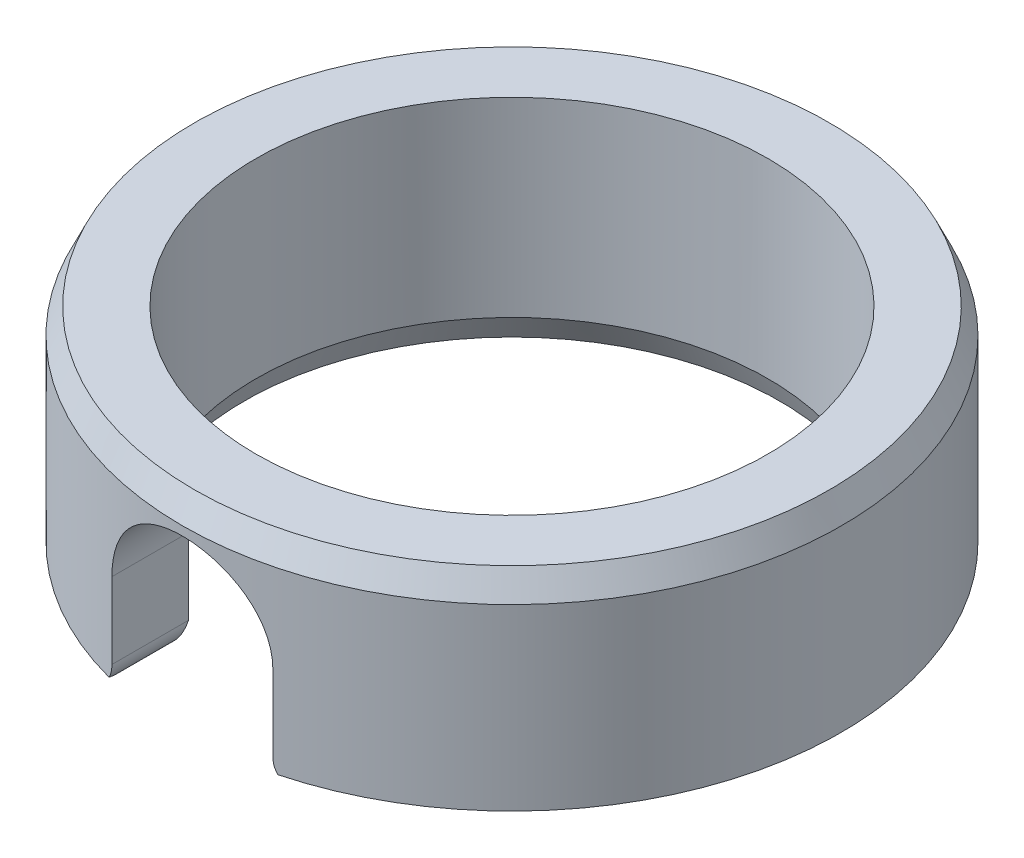
ISO-10303-21;
HEADER;
FILE_DESCRIPTION(('STEP AP214'),'2;1');
FILE_NAME('part.step','',(''),(''),'','','');
FILE_SCHEMA(('AUTOMOTIVE_DESIGN { 1 0 10303 214 1 1 1 1 }'));
ENDSEC;
DATA;
#1=APPLICATION_CONTEXT('core data for automotive mechanical design processes');
#2=APPLICATION_PROTOCOL_DEFINITION('international standard','automotive_design',2000,#1);
#3=PRODUCT_CONTEXT('',#1,'mechanical');
#4=PRODUCT('Part','Part','',(#3));
#5=PRODUCT_RELATED_PRODUCT_CATEGORY('part','',(#4));
#6=PRODUCT_DEFINITION_FORMATION('','',#4);
#7=PRODUCT_DEFINITION_CONTEXT('part definition',#1,'design');
#8=PRODUCT_DEFINITION('design','',#6,#7);
#9=PRODUCT_DEFINITION_SHAPE('','',#8);
#10=(LENGTH_UNIT() NAMED_UNIT(*) SI_UNIT(.MILLI.,.METRE.));
#11=(NAMED_UNIT(*) PLANE_ANGLE_UNIT() SI_UNIT($,.RADIAN.));
#12=(NAMED_UNIT(*) SI_UNIT($,.STERADIAN.) SOLID_ANGLE_UNIT());
#13=UNCERTAINTY_MEASURE_WITH_UNIT(LENGTH_MEASURE(1.E-05),#10,'distance_accuracy_value','');
#14=(GEOMETRIC_REPRESENTATION_CONTEXT(3) GLOBAL_UNCERTAINTY_ASSIGNED_CONTEXT((#13)) GLOBAL_UNIT_ASSIGNED_CONTEXT((#10,
#11,#12)) REPRESENTATION_CONTEXT('',''));
#15=CARTESIAN_POINT('',(0.,0.,0.));
#16=DIRECTION('',(0.,0.,1.));
#17=DIRECTION('',(1.,0.,0.));
#18=AXIS2_PLACEMENT_3D('',#15,#16,#17);
#19=CARTESIAN_POINT('',(0.,0.,0.));
#20=DIRECTION('',(0.,1.,0.));
#21=DIRECTION('',(0.,0.,1.));
#22=AXIS2_PLACEMENT_3D('',#19,#20,#21);
#23=PLANE('',#22);
#24=CARTESIAN_POINT('',(0.,0.,0.));
#25=DIRECTION('',(0.,1.,0.));
#26=DIRECTION('',(0.,0.,1.));
#27=AXIS2_PLACEMENT_3D('',#24,#25,#26);
#28=CIRCLE('',#27,12.);
#29=CARTESIAN_POINT('',(-4.175,0.,11.2503055514061));
#30=VERTEX_POINT('',#29);
#31=CARTESIAN_POINT('',(4.175,0.,11.2503055514061));
#32=VERTEX_POINT('',#31);
#33=EDGE_CURVE('E165',#30,#32,#28,.F.);
#34=ORIENTED_EDGE('',*,*,#33,.T.);
#35=DIRECTION('',(0.,0.,-1.));
#36=VECTOR('',#35,1.);
#37=CARTESIAN_POINT('',(4.175,0.,10.0780073688594));
#38=LINE('',#37,#36);
#39=CARTESIAN_POINT('',(4.175,0.,9.70650465032521));
#40=VERTEX_POINT('',#39);
#41=EDGE_CURVE('E168',#32,#40,#38,.T.);
#42=ORIENTED_EDGE('',*,*,#41,.T.);
#43=CARTESIAN_POINT('',(0.,0.,0.));
#44=DIRECTION('',(0.,1.,0.));
#45=DIRECTION('',(0.,0.,1.));
#46=AXIS2_PLACEMENT_3D('',#43,#44,#45);
#47=CIRCLE('',#46,10.566307658155);
#48=CARTESIAN_POINT('',(-4.175,0.,9.70650465032521));
#49=VERTEX_POINT('',#48);
#50=EDGE_CURVE('E172',#40,#49,#47,.T.);
#51=ORIENTED_EDGE('',*,*,#50,.T.);
#52=DIRECTION('',(0.,0.,-1.));
#53=VECTOR('',#52,1.);
#54=CARTESIAN_POINT('',(-4.175,0.,11.5723539092096));
#55=LINE('',#54,#53);
#56=EDGE_CURVE('E171',#49,#30,#55,.F.);
#57=ORIENTED_EDGE('',*,*,#56,.T.);
#58=EDGE_LOOP('',(#34,#42,#51,#57));
#59=FACE_BOUND('',#58,.T.);
#60=ADVANCED_FACE('F36',(#59),#23,.F.);
#61=CARTESIAN_POINT('',(0.,8.5222,0.));
#62=DIRECTION('',(0.,-1.,0.));
#63=DIRECTION('',(0.,0.,-1.));
#64=AXIS2_PLACEMENT_3D('',#61,#62,#63);
#65=CYLINDRICAL_SURFACE('',#64,13.);
#66=CARTESIAN_POINT('',(0.,7.52219999999998,0.));
#67=DIRECTION('',(0.,1.,0.));
#68=DIRECTION('',(0.,0.,1.));
#69=AXIS2_PLACEMENT_3D('',#66,#67,#68);
#70=CIRCLE('',#69,13.);
#71=CARTESIAN_POINT('',(0.,7.52219999999998,13.));
#72=VERTEX_POINT('',#71);
#73=EDGE_CURVE('E242',#72,#72,#70,.F.);
#74=ORIENTED_EDGE('',*,*,#73,.T.);
#75=EDGE_LOOP('',(#74));
#76=FACE_BOUND('',#75,.T.);
#77=DIRECTION('',(0.,-1.,0.));
#78=VECTOR('',#77,1.);
#79=CARTESIAN_POINT('',(3.175,8.5222,12.6063228183321));
#80=LINE('',#79,#78);
#81=CARTESIAN_POINT('',(3.175,1.,12.6063228183321));
#82=VERTEX_POINT('',#81);
#83=CARTESIAN_POINT('',(3.175,4.,12.6063228183321));
#84=VERTEX_POINT('',#83);
#85=EDGE_CURVE('E109',#82,#84,#80,.F.);
#86=ORIENTED_EDGE('',*,*,#85,.F.);
#87=CARTESIAN_POINT('',(3.175,1.,12.6063228183321));
#88=CARTESIAN_POINT('',(3.17500023984745,0.972207944779752,12.6063221924203));
#89=CARTESIAN_POINT('',(3.17615952654659,0.944431586658988,12.6060308357941));
#90=CARTESIAN_POINT('',(3.18078206207391,0.889080668877479,12.604865491831));
#91=CARTESIAN_POINT('',(3.18424555028913,0.861506130485058,12.6039914439573));
#92=CARTESIAN_POINT('',(3.19784301795716,0.78070290364726,12.6005512176184));
#93=CARTESIAN_POINT('',(3.21118821717571,0.728004388055886,12.5971663252682));
#94=CARTESIAN_POINT('',(3.24117892568194,0.64015772501383,12.5894766939692));
#95=CARTESIAN_POINT('',(3.25582690792811,0.604257448940297,12.5857019888294));
#96=CARTESIAN_POINT('',(3.28939991579291,0.533887391529717,12.5769688879727));
#97=CARTESIAN_POINT('',(3.30839504268942,0.499453452204882,12.5719910065933));
#98=CARTESIAN_POINT('',(3.32932128780724,0.466307658155002,12.5664481760979));
#99=B_SPLINE_CURVE_WITH_KNOTS('',3,(#87,#88,#89,#90,#91,#92,#93,#94,#95,#96,#97,#98),
.UNSPECIFIED.,.F.,.F.,(4,2,2,2,2,4),(0.,0.0833193461441916,0.166647349815072,0.329185528440588,
0.445804285504046,0.564455786169551),.UNSPECIFIED.);
#100=CARTESIAN_POINT('',(3.32932128780724,0.466307658155002,12.5664481760979));
#101=VERTEX_POINT('',#100);
#102=EDGE_CURVE('E217',#82,#101,#99,.T.);
#103=ORIENTED_EDGE('',*,*,#102,.T.);
#104=CARTESIAN_POINT('',(0.,0.466307658155002,0.));
#105=DIRECTION('',(0.,1.,0.));
#106=DIRECTION('',(0.,0.,1.));
#107=AXIS2_PLACEMENT_3D('',#104,#105,#106);
#108=CIRCLE('',#107,13.);
#109=CARTESIAN_POINT('',(-3.32932128780724,0.466307658155002,12.5664481760979));
#110=VERTEX_POINT('',#109);
#111=EDGE_CURVE('E245',#101,#110,#108,.T.);
#112=ORIENTED_EDGE('',*,*,#111,.T.);
#113=CARTESIAN_POINT('',(-3.32932128780724,0.466307658155002,12.5664481760979));
#114=CARTESIAN_POINT('',(-3.3146339147258,0.489581659288447,12.5703391937686));
#115=CARTESIAN_POINT('',(-3.30089432935479,0.513483028317116,12.5739520155139));
#116=CARTESIAN_POINT('',(-3.27540392853389,0.562405435888356,12.5806161824473));
#117=CARTESIAN_POINT('',(-3.26365356886449,0.587426729377128,12.5836673989718));
#118=CARTESIAN_POINT('',(-3.23206671790876,0.662686016902155,12.5918312691069));
#119=CARTESIAN_POINT('',(-3.2151587310711,0.714289331923373,12.5961470879905));
#120=CARTESIAN_POINT('',(-3.19348463363715,0.804705918081518,12.6016564351079));
#121=CARTESIAN_POINT('',(-3.18663700431524,0.843009026171563,12.6033877929176));
#122=CARTESIAN_POINT('',(-3.17735131405145,0.920859328719894,12.6057306401717));
#123=CARTESIAN_POINT('',(-3.17499236067866,0.960416567577988,12.6063220415455));
#124=CARTESIAN_POINT('',(-3.175,1.,12.6063228183321));
#125=B_SPLINE_CURVE_WITH_KNOTS('',3,(#113,#114,#115,#116,#117,#118,#119,#120,#121,#122,#123,
#124),.UNSPECIFIED.,.F.,.F.,(4,2,2,2,2,4),(0.,0.083329666978949,0.166678401066295,
0.329241375331635,0.44582986509137,0.564454717051472),.UNSPECIFIED.);
#126=CARTESIAN_POINT('',(-3.175,1.,12.6063228183321));
#127=VERTEX_POINT('',#126);
#128=EDGE_CURVE('E52',#110,#127,#125,.T.);
#129=ORIENTED_EDGE('',*,*,#128,.T.);
#130=DIRECTION('',(0.,-1.,0.));
#131=VECTOR('',#130,1.);
#132=CARTESIAN_POINT('',(-3.175,8.5222,12.6063228183321));
#133=LINE('',#132,#131);
#134=CARTESIAN_POINT('',(-3.175,4.,12.6063228183321));
#135=VERTEX_POINT('',#134);
#136=EDGE_CURVE('E110',#135,#127,#133,.T.);
#137=ORIENTED_EDGE('',*,*,#136,.F.);
#138=CARTESIAN_POINT('',(3.175,4.,12.6063228183321));
#139=CARTESIAN_POINT('',(3.17501009851098,4.08787378597044,12.6063132651038));
#140=CARTESIAN_POINT('',(3.17135205246371,4.17574163314016,12.6072414061624));
#141=CARTESIAN_POINT('',(3.15677809224827,4.35082163667164,12.6109022385434));
#142=CARTESIAN_POINT('',(3.14586335778261,4.43803389728038,12.6136346365515));
#143=CARTESIAN_POINT('',(3.11688221350419,4.61102183710995,12.6208262840811));
#144=CARTESIAN_POINT('',(3.09882956040884,4.69679995081072,12.6252822115338));
#145=CARTESIAN_POINT('',(3.05573924696344,4.86646035879583,12.6357803710173));
#146=CARTESIAN_POINT('',(3.0307014992745,4.95034262936113,12.6418226228829));
#147=CARTESIAN_POINT('',(2.94538203174719,5.19825788694416,12.6620768224457));
#148=CARTESIAN_POINT('',(2.87486550593256,5.35872839791942,12.6784237603703));
#149=CARTESIAN_POINT('',(2.70871790710507,5.66552296377543,12.7149532550345));
#150=CARTESIAN_POINT('',(2.61308061908652,5.81184350560743,12.7351367606187));
#151=CARTESIAN_POINT('',(2.39725547071148,6.08931557258449,12.7775372544766));
#152=CARTESIAN_POINT('',(2.2766401517653,6.22013049083328,12.7997853209167));
#153=CARTESIAN_POINT('',(2.01520014546072,6.45989161030491,12.8435394802179));
#154=CARTESIAN_POINT('',(1.87437224902378,6.56883433235655,12.8650454545859));
#155=CARTESIAN_POINT('',(1.57419315491871,6.76313546468767,12.9052358723955));
#156=CARTESIAN_POINT('',(1.41462099510097,6.84816180457834,12.9238790969982));
#157=CARTESIAN_POINT('',(1.08292663079487,6.99005332171802,12.9558862783522));
#158=CARTESIAN_POINT('',(0.910806824940755,7.04692386517736,12.9692512409886));
#159=CARTESIAN_POINT('',(0.562432144797513,7.12981307329099,12.9889763366451));
#160=CARTESIAN_POINT('',(0.386321836070524,7.15640771066527,12.9954670729382));
#161=CARTESIAN_POINT('',(0.0320237903202308,7.17979674776153,13.001167073455));
#162=CARTESIAN_POINT('',(-0.146163696822422,7.17659469576418,13.0003772046755));
#163=CARTESIAN_POINT('',(-0.495559824196341,7.14089726494223,12.9917024330288));
#164=CARTESIAN_POINT('',(-0.66683633645111,7.10902408502989,12.9839682372075));
#165=CARTESIAN_POINT('',(-1.00153097298404,7.01788790399895,12.9624486739077));
#166=CARTESIAN_POINT('',(-1.16494875857107,6.95862372356376,12.9486630458867));
#167=CARTESIAN_POINT('',(-1.48094705402903,6.81387467110486,12.9163565307896));
#168=CARTESIAN_POINT('',(-1.63342041224417,6.72816524782373,12.8977953267573));
#169=CARTESIAN_POINT('',(-1.92203607368809,6.53313014203601,12.8579560541876));
#170=CARTESIAN_POINT('',(-2.05817604688336,6.42380109629582,12.8366775989132));
#171=CARTESIAN_POINT('',(-2.3139591897748,6.18129971086971,12.7930794362632));
#172=CARTESIAN_POINT('',(-2.43308733710246,6.04758592906107,12.7707470254997));
#173=CARTESIAN_POINT('',(-2.64736905217607,5.76180547562919,12.7280561405833));
#174=CARTESIAN_POINT('',(-2.74251606792799,5.60973380511136,12.7076982068187));
#175=CARTESIAN_POINT('',(-2.90645104355116,5.29055437412133,12.6712137286851));
#176=CARTESIAN_POINT('',(-2.97510532370128,5.12337547964163,12.6551087699541));
#177=CARTESIAN_POINT('',(-3.08308837814951,4.77946170261939,12.6292399245633));
#178=CARTESIAN_POINT('',(-3.12246093942907,4.60274151404603,12.6194665726462));
#179=CARTESIAN_POINT('',(-3.15603300411806,4.3537543037499,12.6110871362746));
#180=CARTESIAN_POINT('',(-3.16314703165299,4.28314345543998,12.6093031675515));
#181=CARTESIAN_POINT('',(-3.17262509936245,4.14169952347456,12.6069215996323));
#182=CARTESIAN_POINT('',(-3.17499687265751,4.07086699058227,12.6063220690103));
#183=CARTESIAN_POINT('',(-3.175,4.,12.6063228183321));
#184=B_SPLINE_CURVE_WITH_KNOTS('',3,(#138,#139,#140,#141,#142,#143,#144,#145,#146,#147,#148,
#149,#150,#151,#152,#153,#154,#155,#156,#157,#158,#159,#160,#161,#162,#163,#164,#165,#166,#167,
#168,#169,#170,#171,#172,#173,#174,#175,#176,#177,#178,#179,#180,#181,#182,#183),.UNSPECIFIED.,
.F.,.F.,(4,2,2,2,2,2,2,2,2,2,2,2,2,2,2,2,2,2,2,2,2,2,4),(0.,0.263530091183203,0.527017351380499,
0.789999255766269,1.05298444852231,1.57844638130477,2.10403843871948,2.63950435018495,
3.17505536988955,3.71771158457418,4.26026433461408,4.79231333969312,5.32429898756418,
5.84501121703347,6.36574586780086,6.8910298674039,7.41638871234221,7.95527466181701,
8.49430768356239,9.03602611501808,9.57693283955251,9.78977044600888,10.0022606974916),.UNSPECIFIED.);
#185=EDGE_CURVE('E100',#84,#135,#184,.T.);
#186=ORIENTED_EDGE('',*,*,#185,.F.);
#187=EDGE_LOOP('',(#86,#103,#112,#129,#137,#186));
#188=FACE_BOUND('',#187,.T.);
#189=ADVANCED_FACE('F118',(#76,#188),#65,.T.);
#190=CARTESIAN_POINT('',(0.,8.5222,0.));
#191=DIRECTION('',(0.,-1.,0.));
#192=DIRECTION('',(0.,0.,-1.));
#193=AXIS2_PLACEMENT_3D('',#190,#191,#192);
#194=CYLINDRICAL_SURFACE('',#193,10.1);
#195=CARTESIAN_POINT('',(0.,8.5222,0.));
#196=DIRECTION('',(0.,1.,0.));
#197=DIRECTION('',(0.,0.,1.));
#198=AXIS2_PLACEMENT_3D('',#195,#196,#197);
#199=CIRCLE('',#198,10.1);
#200=CARTESIAN_POINT('',(0.,8.5222,10.1));
#201=VERTEX_POINT('',#200);
#202=EDGE_CURVE('E257',#201,#201,#199,.T.);
#203=ORIENTED_EDGE('',*,*,#202,.T.);
#204=EDGE_LOOP('',(#203));
#205=FACE_BOUND('',#204,.T.);
#206=DIRECTION('',(0.,-1.,0.));
#207=VECTOR('',#206,1.);
#208=CARTESIAN_POINT('',(-3.175,8.5222,9.58798075717719));
#209=LINE('',#208,#207);
#210=CARTESIAN_POINT('',(-3.175,4.,9.58798075717719));
#211=VERTEX_POINT('',#210);
#212=CARTESIAN_POINT('',(-3.175,1.00000000000001,9.58798075717719));
#213=VERTEX_POINT('',#212);
#214=EDGE_CURVE('E116',#211,#213,#209,.T.);
#215=ORIENTED_EDGE('',*,*,#214,.T.);
#216=CARTESIAN_POINT('',(0.,1.00000000000001,0.));
#217=DIRECTION('',(0.,1.,0.));
#218=DIRECTION('',(0.,0.,1.));
#219=AXIS2_PLACEMENT_3D('',#216,#217,#218);
#220=CIRCLE('',#219,10.1);
#221=CARTESIAN_POINT('',(3.175,1.00000000000001,9.58798075717719));
#222=VERTEX_POINT('',#221);
#223=EDGE_CURVE('E249',#213,#222,#220,.F.);
#224=ORIENTED_EDGE('',*,*,#223,.T.);
#225=DIRECTION('',(0.,-1.,0.));
#226=VECTOR('',#225,1.);
#227=CARTESIAN_POINT('',(3.175,8.5222,9.58798075717719));
#228=LINE('',#227,#226);
#229=CARTESIAN_POINT('',(3.175,4.,9.58798075717719));
#230=VERTEX_POINT('',#229);
#231=EDGE_CURVE('E147',#222,#230,#228,.F.);
#232=ORIENTED_EDGE('',*,*,#231,.T.);
#233=CARTESIAN_POINT('',(3.175,4.,9.58798075717719));
#234=CARTESIAN_POINT('',(3.17501110403846,4.08692347838906,9.58796790786724));
#235=CARTESIAN_POINT('',(3.17143060657522,4.17383967538083,9.58916251621892));
#236=CARTESIAN_POINT('',(3.15717284476817,4.34700422154223,9.5938710908655));
#237=CARTESIAN_POINT('',(3.14649730839338,4.43325272815239,9.59738449242591));
#238=CARTESIAN_POINT('',(3.11817420570668,4.60423985769642,9.6066226645862));
#239=CARTESIAN_POINT('',(3.10054558646608,4.68898193521027,9.61234142467388));
#240=CARTESIAN_POINT('',(3.05849249682685,4.8565761805437,9.62580427323813));
#241=CARTESIAN_POINT('',(3.03406782069659,4.93942829106765,9.63354842302729));
#242=CARTESIAN_POINT('',(2.95090981681227,5.18422100488252,9.65947949565651));
#243=CARTESIAN_POINT('',(2.88225359091744,5.3426302969105,9.68037855294418));
#244=CARTESIAN_POINT('',(2.72064109945418,5.64569216879029,9.72703165664799));
#245=CARTESIAN_POINT('',(2.62767200972875,5.79033743353579,9.75278826324065));
#246=CARTESIAN_POINT('',(2.4166165716316,6.06682215665654,9.80725167648352));
#247=CARTESIAN_POINT('',(2.29783454248537,6.19811841550925,9.83602563189224));
#248=CARTESIAN_POINT('',(2.04001349194838,6.43929190011796,9.89271164234553));
#249=CARTESIAN_POINT('',(1.900970982496,6.54916543008779,9.92062354797402));
#250=CARTESIAN_POINT('',(1.60263746566888,6.74679940664522,9.97321313387937));
#251=CARTESIAN_POINT('',(1.44295542775338,6.83399534559063,9.99780203011461));
#252=CARTESIAN_POINT('',(1.11029445485004,6.98007509157532,10.0401847718689));
#253=CARTESIAN_POINT('',(0.937319227682667,7.03896676041487,10.0579805039758));
#254=CARTESIAN_POINT('',(0.588704828610891,7.12494295664201,10.0842954772797));
#255=CARTESIAN_POINT('',(0.41331721675818,7.1529626730543,10.0930868607303));
#256=CARTESIAN_POINT('',(0.0601209450263003,7.17936362250599,10.101364266219));
#257=CARTESIAN_POINT('',(-0.117687199257961,7.17775107174336,10.1008522399082));
#258=CARTESIAN_POINT('',(-0.464085359933637,7.14554536770283,10.0907691973101));
#259=CARTESIAN_POINT('',(-0.63278040055622,7.11596665944189,10.0815152941289));
#260=CARTESIAN_POINT('',(-0.962675979439209,7.03033458117567,10.0553791770672));
#261=CARTESIAN_POINT('',(-1.12387611290808,6.97427978304667,10.0384965516945));
#262=CARTESIAN_POINT('',(-1.43653957134369,6.83663891109923,9.99857598515466));
#263=CARTESIAN_POINT('',(-1.58785826282529,6.75474643258653,9.97546468564356));
#264=CARTESIAN_POINT('',(-1.8749181551735,6.5680046876658,9.92551969960479));
#265=CARTESIAN_POINT('',(-2.01065552623607,6.46314979555823,9.89868510147521));
#266=CARTESIAN_POINT('',(-2.26873919353474,6.22826058277902,9.84281463940079));
#267=CARTESIAN_POINT('',(-2.39028220563004,6.09735275424085,9.81373366163234));
#268=CARTESIAN_POINT('',(-2.60994860345359,5.81674891470858,9.75761508849663));
#269=CARTESIAN_POINT('',(-2.70806489398501,5.66704723255653,9.73057811388186));
#270=CARTESIAN_POINT('',(-2.87908914208688,5.35060294375097,9.68136955450722));
#271=CARTESIAN_POINT('',(-2.95168204929347,5.18367817378625,9.65925993200412));
#272=CARTESIAN_POINT('',(-3.03846181932092,4.92555211717256,9.63216694333008));
#273=CARTESIAN_POINT('',(-3.06370112936791,4.83823536851029,9.62414867935728));
#274=CARTESIAN_POINT('',(-3.10663023235459,4.66160158960844,9.6103778519474));
#275=CARTESIAN_POINT('',(-3.12432349221659,4.57228549783227,9.60462424813925));
#276=CARTESIAN_POINT('',(-3.15040966796892,4.40256320321831,9.59609773866992));
#277=CARTESIAN_POINT('',(-3.15962996628368,4.3222957234519,9.59306073111703));
#278=CARTESIAN_POINT('',(-3.17192450252452,4.16135496600783,9.58899906712817));
#279=CARTESIAN_POINT('',(-3.17500736109734,4.08068241730107,9.58797158814452));
#280=CARTESIAN_POINT('',(-3.175,4.,9.58798075717719));
#281=B_SPLINE_CURVE_WITH_KNOTS('',3,(#233,#234,#235,#236,#237,#238,#239,#240,#241,#242,#243,
#244,#245,#246,#247,#248,#249,#250,#251,#252,#253,#254,#255,#256,#257,#258,#259,#260,#261,#262,
#263,#264,#265,#266,#267,#268,#269,#270,#271,#272,#273,#274,#275,#276,#277,#278,#279,#280),
.UNSPECIFIED.,.F.,.F.,(4,2,2,2,2,2,2,2,2,2,2,2,2,2,2,2,2,2,2,2,2,2,2,4),(0.,0.260676156874212,
0.521288850341595,0.781196229940401,1.04111147836541,1.56024307553596,2.07964905009505,
2.61532835383672,3.15109998978589,3.69915064935121,4.24704899414307,4.77785030629928,
5.30854026928509,5.82068985563875,6.33286707056274,6.85136210322621,7.36998430749708,
7.91041830266016,8.45101577077696,8.99806944537035,9.27150581261408,9.5448164178363,
9.787120626554,10.0290842540233),.UNSPECIFIED.);
#282=EDGE_CURVE('E140',#230,#211,#281,.T.);
#283=ORIENTED_EDGE('',*,*,#282,.T.);
#284=EDGE_LOOP('',(#215,#224,#232,#283));
#285=FACE_BOUND('',#284,.T.);
#286=ADVANCED_FACE('F149',(#205,#285),#194,.F.);
#287=CARTESIAN_POINT('',(0.,8.5222,0.));
#288=DIRECTION('',(0.,1.,0.));
#289=DIRECTION('',(0.,0.,1.));
#290=AXIS2_PLACEMENT_3D('',#287,#288,#289);
#291=PLANE('',#290);
#292=CARTESIAN_POINT('',(0.,8.5222,0.));
#293=DIRECTION('',(0.,1.,0.));
#294=DIRECTION('',(0.,0.,1.));
#295=AXIS2_PLACEMENT_3D('',#292,#293,#294);
#296=CIRCLE('',#295,12.533692341845);
#297=CARTESIAN_POINT('',(0.,8.5222,12.533692341845));
#298=VERTEX_POINT('',#297);
#299=EDGE_CURVE('E182',#298,#298,#296,.T.);
#300=ORIENTED_EDGE('',*,*,#299,.T.);
#301=EDGE_LOOP('',(#300));
#302=FACE_BOUND('',#301,.T.);
#303=ORIENTED_EDGE('',*,*,#202,.F.);
#304=EDGE_LOOP('',(#303));
#305=FACE_BOUND('',#304,.T.);
#306=ADVANCED_FACE('F153',(#302,#305),#291,.T.);
#307=CARTESIAN_POINT('',(3.175,0.,13.));
#308=DIRECTION('',(-1.,0.,0.));
#309=DIRECTION('',(0.,-1.,0.));
#310=AXIS2_PLACEMENT_3D('',#307,#308,#309);
#311=PLANE('',#310);
#312=ORIENTED_EDGE('',*,*,#231,.F.);
#313=DIRECTION('',(0.,0.,-1.));
#314=VECTOR('',#313,1.);
#315=CARTESIAN_POINT('',(3.175,1.,11.5723539092096));
#316=LINE('',#315,#314);
#317=EDGE_CURVE('E252',#222,#82,#316,.F.);
#318=ORIENTED_EDGE('',*,*,#317,.T.);
#319=ORIENTED_EDGE('',*,*,#85,.T.);
#320=DIRECTION('',(0.,0.,-1.));
#321=VECTOR('',#320,1.);
#322=CARTESIAN_POINT('',(3.175,4.,13.));
#323=LINE('',#322,#321);
#324=EDGE_CURVE('E107',#84,#230,#323,.T.);
#325=ORIENTED_EDGE('',*,*,#324,.T.);
#326=EDGE_LOOP('',(#312,#318,#319,#325));
#327=FACE_BOUND('',#326,.T.);
#328=ADVANCED_FACE('F136',(#327),#311,.T.);
#329=CARTESIAN_POINT('',(0.,4.,13.));
#330=DIRECTION('',(0.,0.,-1.));
#331=DIRECTION('',(-1.,0.,0.));
#332=AXIS2_PLACEMENT_3D('',#329,#330,#331);
#333=CYLINDRICAL_SURFACE('',#332,3.175);
#334=ORIENTED_EDGE('',*,*,#185,.T.);
#335=DIRECTION('',(0.,0.,-1.));
#336=VECTOR('',#335,1.);
#337=CARTESIAN_POINT('',(-3.175,4.,13.));
#338=LINE('',#337,#336);
#339=EDGE_CURVE('E104',#135,#211,#338,.T.);
#340=ORIENTED_EDGE('',*,*,#339,.T.);
#341=ORIENTED_EDGE('',*,*,#282,.F.);
#342=ORIENTED_EDGE('',*,*,#324,.F.);
#343=EDGE_LOOP('',(#334,#340,#341,#342));
#344=FACE_BOUND('',#343,.T.);
#345=ADVANCED_FACE('F102',(#344),#333,.F.);
#346=CARTESIAN_POINT('',(-3.175,4.,13.));
#347=DIRECTION('',(1.,0.,0.));
#348=DIRECTION('',(0.,1.,0.));
#349=AXIS2_PLACEMENT_3D('',#346,#347,#348);
#350=PLANE('',#349);
#351=ORIENTED_EDGE('',*,*,#136,.T.);
#352=DIRECTION('',(0.,0.,-1.));
#353=VECTOR('',#352,1.);
#354=CARTESIAN_POINT('',(-3.175,1.,10.0780073688594));
#355=LINE('',#354,#353);
#356=EDGE_CURVE('E11',#127,#213,#355,.T.);
#357=ORIENTED_EDGE('',*,*,#356,.T.);
#358=ORIENTED_EDGE('',*,*,#214,.F.);
#359=ORIENTED_EDGE('',*,*,#339,.F.);
#360=EDGE_LOOP('',(#351,#357,#358,#359));
#361=FACE_BOUND('',#360,.T.);
#362=ADVANCED_FACE('F113',(#361),#350,.T.);
#363=CARTESIAN_POINT('',(0.,0.,0.));
#364=DIRECTION('',(0.,-1.,0.));
#365=DIRECTION('',(0.,0.,-1.));
#366=AXIS2_PLACEMENT_3D('',#363,#364,#365);
#367=CONICAL_SURFACE('',#366,10.566307658155,0.436332312998579);
#368=ORIENTED_EDGE('',*,*,#50,.F.);
#369=CARTESIAN_POINT('',(4.175,0.,9.70650465032521));
#370=CARTESIAN_POINT('',(4.15178650335925,6.74065175684977E-07,9.71648936557001));
#371=CARTESIAN_POINT('',(4.12839339644712,0.000809098266087378,9.72604173493708));
#372=CARTESIAN_POINT('',(4.08134610284464,0.0041152155076517,9.7442063733783));
#373=CARTESIAN_POINT('',(4.05769175296476,0.00661403094162862,9.75281801340739));
#374=CARTESIAN_POINT('',(3.98642411751239,0.016770560036007,9.7771459331305));
#375=CARTESIAN_POINT('',(3.93861197351461,0.0270890326182697,9.79130942870474));
#376=CARTESIAN_POINT('',(3.8437702338645,0.0551492285800891,9.81487905605967));
#377=CARTESIAN_POINT('',(3.79674461617234,0.0729209998354879,9.82426558665674));
#378=CARTESIAN_POINT('',(3.70538803050179,0.11569252051026,9.83777558167108));
#379=CARTESIAN_POINT('',(3.66105165475648,0.140677140300506,9.84190996592492));
#380=CARTESIAN_POINT('',(3.57944877465298,0.195284977406764,9.84478070941037));
#381=CARTESIAN_POINT('',(3.54190703278643,0.224481040192056,9.8438627267201));
#382=CARTESIAN_POINT('',(3.47152555877191,0.287705946175027,9.83764502968649));
#383=CARTESIAN_POINT('',(3.43868876100391,0.321737779223979,9.83234259468396));
#384=CARTESIAN_POINT('',(3.37854085874323,0.393499611575259,9.81779018596452));
#385=CARTESIAN_POINT('',(3.35122065900662,0.431223368941401,9.80854678934698));
#386=CARTESIAN_POINT('',(3.30242848444132,0.509345759311835,9.78664259478797));
#387=CARTESIAN_POINT('',(3.28095753545487,0.549744859975724,9.7739811981715));
#388=CARTESIAN_POINT('',(3.24224113145156,0.636120465161515,9.74445495039217));
#389=CARTESIAN_POINT('',(3.22558689300589,0.682263218911122,9.7273059058396));
#390=CARTESIAN_POINT('',(3.19934277947981,0.775423002805641,9.69023220561571));
#391=CARTESIAN_POINT('',(3.18975323224581,0.822440073420603,9.67030742118351));
#392=CARTESIAN_POINT('',(3.18068478798804,0.891255148014203,9.63950861709297));
#393=CARTESIAN_POINT('',(3.17854129311755,0.913118275408916,9.62948054734197));
#394=CARTESIAN_POINT('',(3.17570112851092,0.956683049558224,9.60902458956578));
#395=CARTESIAN_POINT('',(3.17500075976591,0.978384966737057,9.59859779368153));
#396=CARTESIAN_POINT('',(3.17499999999875,1.00000000000004,9.58798075717765));
#397=B_SPLINE_CURVE_WITH_KNOTS('',3,(#369,#370,#371,#372,#373,#374,#375,#376,#377,#378,#379,
#380,#381,#382,#383,#384,#385,#386,#387,#388,#389,#390,#391,#392,#393,#394,#395,#396),
.UNSPECIFIED.,.F.,.F.,(4,2,2,2,2,2,2,2,2,2,2,2,2,4),(0.,0.0757767317263039,0.151603827466221,
0.303599802266566,0.456214528456105,0.608511428378114,0.750524238364796,0.892625236939688,
1.0344900047593,1.17637963684383,1.33168069014493,1.48698894994454,1.55939580269516,
1.63161683076212),.UNSPECIFIED.);
#398=EDGE_CURVE('E178',#40,#222,#397,.T.);
#399=ORIENTED_EDGE('',*,*,#398,.T.);
#400=ORIENTED_EDGE('',*,*,#223,.F.);
#401=CARTESIAN_POINT('',(-3.175,1.,9.58798075717719));
#402=CARTESIAN_POINT('',(-3.17496854698984,0.946239218684941,9.61438309462444));
#403=CARTESIAN_POINT('',(-3.1793384511909,0.891803868981645,9.63967909242346));
#404=CARTESIAN_POINT('',(-3.19732102050281,0.78273168016029,9.6873128488399));
#405=CARTESIAN_POINT('',(-3.21099665885834,0.72809600711515,9.70962920500981));
#406=CARTESIAN_POINT('',(-3.24811952427756,0.62032249203401,9.75025691689929));
#407=CARTESIAN_POINT('',(-3.27160740326202,0.567191874783772,9.7685511219928));
#408=CARTESIAN_POINT('',(-3.32826587940373,0.464791316171876,9.79983492347963));
#409=CARTESIAN_POINT('',(-3.36140869558973,0.415510805450993,9.81283948646986));
#410=CARTESIAN_POINT('',(-3.43241770967107,0.328157609247358,9.83136983482095));
#411=CARTESIAN_POINT('',(-3.46932061485449,0.289447679071895,9.83757702020648));
#412=CARTESIAN_POINT('',(-3.54913391135357,0.218243149476815,9.84436638654558));
#413=CARTESIAN_POINT('',(-3.5920388921836,0.185743014068,9.84495360081161));
#414=CARTESIAN_POINT('',(-3.67716285219476,0.131428865295951,9.84049840817687));
#415=CARTESIAN_POINT('',(-3.7189135263868,0.108823069750396,9.83608341023625));
#416=CARTESIAN_POINT('',(-3.80462255656868,0.0699253275393456,9.82270347155137));
#417=CARTESIAN_POINT('',(-3.84858371908966,0.05364164864783,9.81373260798369));
#418=CARTESIAN_POINT('',(-3.93999891454142,0.0267703831713041,9.79091007179516));
#419=CARTESIAN_POINT('',(-3.98750515379441,0.0165793007179311,9.77679978093443));
#420=CARTESIAN_POINT('',(-4.05833595730351,0.00654133216267081,9.75258635341864));
#421=CARTESIAN_POINT('',(-4.08186028388463,0.00407002726975992,9.74401349726912));
#422=CARTESIAN_POINT('',(-4.12864869179017,0.000800338802658234,9.7259374406508));
#423=CARTESIAN_POINT('',(-4.15191294388662,7.84459773478916E-07,9.71643489615133));
#424=CARTESIAN_POINT('',(-4.175,0.,9.70650465032521));
#425=B_SPLINE_CURVE_WITH_KNOTS('',3,(#401,#402,#403,#404,#405,#406,#407,#408,#409,#410,#411,
#412,#413,#414,#415,#416,#417,#418,#419,#420,#421,#422,#423,#424),.UNSPECIFIED.,.F.,.F.,(4,2,2,
2,2,2,2,2,2,2,2,4),(0.,0.179690079972282,0.360608402763578,0.542283818906912,0.72344156293585,
0.884034429324942,1.04448345337386,1.18683793383166,1.32937795687339,1.48039796004169,
1.55581409756825,1.63117740157397),.UNSPECIFIED.);
#426=EDGE_CURVE('E179',#213,#49,#425,.T.);
#427=ORIENTED_EDGE('',*,*,#426,.T.);
#428=EDGE_LOOP('',(#368,#399,#400,#427));
#429=FACE_BOUND('',#428,.T.);
#430=ADVANCED_FACE('F195',(#429),#367,.F.);
#431=CARTESIAN_POINT('',(0.,0.466307658155002,0.));
#432=DIRECTION('',(0.,1.,0.));
#433=DIRECTION('',(0.,0.,1.));
#434=AXIS2_PLACEMENT_3D('',#431,#432,#433);
#435=CONICAL_SURFACE('',#434,13.,1.13446401379632);
#436=ORIENTED_EDGE('',*,*,#111,.F.);
#437=CARTESIAN_POINT('',(3.32932128780724,0.466307658155002,12.5664481760979));
#438=CARTESIAN_POINT('',(3.33917542926672,0.450696082173974,12.5292029929744));
#439=CARTESIAN_POINT('',(3.34955286052906,0.435206442715172,12.4920468850187));
#440=CARTESIAN_POINT('',(3.37142330036725,0.404499916803823,12.4179409659725));
#441=CARTESIAN_POINT('',(3.38291655547084,0.389283091510038,12.380991202387));
#442=CARTESIAN_POINT('',(3.41930215677405,0.343926657471055,12.2701056395651));
#443=CARTESIAN_POINT('',(3.44599143886199,0.314256848757273,12.1965519383351));
#444=CARTESIAN_POINT('',(3.50557432545084,0.255924048074611,12.0493384223677));
#445=CARTESIAN_POINT('',(3.53859598742814,0.227299659302695,11.9757147333084));
#446=CARTESIAN_POINT('',(3.61160760229229,0.172547683448718,11.8311891295564));
#447=CARTESIAN_POINT('',(3.65157895027005,0.146413711380511,11.7602805495392));
#448=CARTESIAN_POINT('',(3.72505407685945,0.106338085422846,11.646917378388));
#449=CARTESIAN_POINT('',(3.75595219880033,0.0913228453573286,11.6031634760947));
#450=CARTESIAN_POINT('',(3.8224511807321,0.0635108632341479,11.518602636011));
#451=CARTESIAN_POINT('',(3.85804561649561,0.0507111448241672,11.4777917882016));
#452=CARTESIAN_POINT('',(3.92492713382381,0.0313231479612791,11.4110866919087));
#453=CARTESIAN_POINT('',(3.95488638866364,0.0239865550682303,11.3840916007743));
#454=CARTESIAN_POINT('',(4.01836353341973,0.0118190976261604,11.3341584285354));
#455=CARTESIAN_POINT('',(4.05186137123609,0.00697493992120313,11.3111992637536));
#456=CARTESIAN_POINT('',(4.10125326797481,0.00262389058032284,11.2833972638559));
#457=CARTESIAN_POINT('',(4.11557968288728,0.00166006463779399,11.2759795359609));
#458=CARTESIAN_POINT('',(4.14484703129648,0.000346783921397324,11.2622534618025));
#459=CARTESIAN_POINT('',(4.159790132962,-2.73185046538625E-07,11.2559495304785));
#460=CARTESIAN_POINT('',(4.175,0.,11.2503055514061));
#461=B_SPLINE_CURVE_WITH_KNOTS('',3,(#437,#438,#439,#440,#441,#442,#443,#444,#445,#446,#447,
#448,#449,#450,#451,#452,#453,#454,#455,#456,#457,#458,#459,#460),.UNSPECIFIED.,.F.,.F.,(4,2,2,
2,2,2,2,2,2,2,2,4),(0.,0.124700800907865,0.249429215914391,0.500284008799411,0.75688209850166,
1.01280354259902,1.1794766400917,1.34592405963169,1.46861163782853,1.59063790856264,
1.63906838235818,1.68768671946608),.UNSPECIFIED.);
#462=EDGE_CURVE('E45',#101,#32,#461,.T.);
#463=ORIENTED_EDGE('',*,*,#462,.T.);
#464=ORIENTED_EDGE('',*,*,#33,.F.);
#465=CARTESIAN_POINT('',(-4.175,0.,11.2503055514061));
#466=CARTESIAN_POINT('',(-4.1381019602181,3.14930727840047E-05,11.2640750754621));
#467=CARTESIAN_POINT('',(-4.10300253213801,0.00203692741588171,11.2814765985873));
#468=CARTESIAN_POINT('',(-4.03678970255124,0.00904060271170865,11.3212804973148));
#469=CARTESIAN_POINT('',(-4.00562169052088,0.013990637895328,11.3435987544555));
#470=CARTESIAN_POINT('',(-3.9286517992872,0.0296068492048749,11.406001238739));
#471=CARTESIAN_POINT('',(-3.88537077825589,0.0419198459016296,11.4486783966369));
#472=CARTESIAN_POINT('',(-3.80497842882904,0.069996245042098,11.5390653723912));
#473=CARTESIAN_POINT('',(-3.76793575391717,0.0857941128911328,11.5868228009845));
#474=CARTESIAN_POINT('',(-3.69714788552218,0.120626363774732,11.6879845469346));
#475=CARTESIAN_POINT('',(-3.66371153109178,0.139794002143313,11.7415555871228));
#476=CARTESIAN_POINT('',(-3.6015476428225,0.179927052163448,11.8507531065855));
#477=CARTESIAN_POINT('',(-3.57282526351999,0.200894394076281,11.9063817554218));
#478=CARTESIAN_POINT('',(-3.51939400114011,0.244117622080119,12.0188994123378));
#479=CARTESIAN_POINT('',(-3.49467843490706,0.266371276761666,12.0757861380439));
#480=CARTESIAN_POINT('',(-3.44865739477402,0.31190585540901,12.1905219956524));
#481=CARTESIAN_POINT('',(-3.42735252232481,0.335186959636629,12.2483712953165));
#482=CARTESIAN_POINT('',(-3.39292074454787,0.376402871889829,12.349618572553));
#483=CARTESIAN_POINT('',(-3.379108117801,0.394153120736451,12.3928614463057));
#484=CARTESIAN_POINT('',(-3.35307006299724,0.429984395411656,12.4795140312484));
#485=CARTESIAN_POINT('',(-3.34083972489885,0.448064189153156,12.5229227738902));
#486=CARTESIAN_POINT('',(-3.32932128780729,0.466307658154841,12.566448176098));
#487=B_SPLINE_CURVE_WITH_KNOTS('',3,(#465,#466,#467,#468,#469,#470,#471,#472,#473,#474,#475,
#476,#477,#478,#479,#480,#481,#482,#483,#484,#485,#486),.UNSPECIFIED.,.F.,.F.,(4,2,2,2,2,2,2,2,
2,2,4),(0.,0.117297029504803,0.232724694179129,0.417816094021977,0.604827401433842,
0.802511552375677,1.00041044298283,1.19797577473201,1.39557590738996,1.54177681854196,
1.68751257399205),.UNSPECIFIED.);
#488=EDGE_CURVE('E60',#30,#110,#487,.T.);
#489=ORIENTED_EDGE('',*,*,#488,.T.);
#490=EDGE_LOOP('',(#436,#463,#464,#489));
#491=FACE_BOUND('',#490,.T.);
#492=ADVANCED_FACE('F199',(#491),#435,.T.);
#493=CARTESIAN_POINT('',(0.,8.5222,0.));
#494=DIRECTION('',(0.,-1.,0.));
#495=DIRECTION('',(0.,0.,-1.));
#496=AXIS2_PLACEMENT_3D('',#493,#494,#495);
#497=CONICAL_SURFACE('',#496,12.533692341845,0.436332312998581);
#498=ORIENTED_EDGE('',*,*,#73,.F.);
#499=EDGE_LOOP('',(#498));
#500=FACE_BOUND('',#499,.T.);
#501=ORIENTED_EDGE('',*,*,#299,.F.);
#502=EDGE_LOOP('',(#501));
#503=FACE_BOUND('',#502,.T.);
#504=ADVANCED_FACE('F205',(#500,#503),#497,.T.);
#505=CARTESIAN_POINT('',(4.175,1.,0.));
#506=DIRECTION('',(0.,0.,1.));
#507=DIRECTION('',(1.,0.,0.));
#508=AXIS2_PLACEMENT_3D('',#505,#506,#507);
#509=CYLINDRICAL_SURFACE('',#508,1.);
#510=ORIENTED_EDGE('',*,*,#102,.F.);
#511=ORIENTED_EDGE('',*,*,#317,.F.);
#512=ORIENTED_EDGE('',*,*,#398,.F.);
#513=ORIENTED_EDGE('',*,*,#41,.F.);
#514=ORIENTED_EDGE('',*,*,#462,.F.);
#515=EDGE_LOOP('',(#510,#511,#512,#513,#514));
#516=FACE_BOUND('',#515,.T.);
#517=ADVANCED_FACE('F176',(#516),#509,.T.);
#518=CARTESIAN_POINT('',(-4.175,1.,13.));
#519=DIRECTION('',(0.,0.,1.));
#520=DIRECTION('',(1.,0.,0.));
#521=AXIS2_PLACEMENT_3D('',#518,#519,#520);
#522=CYLINDRICAL_SURFACE('',#521,1.);
#523=ORIENTED_EDGE('',*,*,#488,.F.);
#524=ORIENTED_EDGE('',*,*,#56,.F.);
#525=ORIENTED_EDGE('',*,*,#426,.F.);
#526=ORIENTED_EDGE('',*,*,#356,.F.);
#527=ORIENTED_EDGE('',*,*,#128,.F.);
#528=EDGE_LOOP('',(#523,#524,#525,#526,#527));
#529=FACE_BOUND('',#528,.T.);
#530=ADVANCED_FACE('F38',(#529),#522,.T.);
#531=CLOSED_SHELL('',(#60,#189,#286,#306,#328,#345,#362,#430,#492,#504,#517,#530));
#532=MANIFOLD_SOLID_BREP('B2',#531);
#533=ADVANCED_BREP_SHAPE_REPRESENTATION('',(#18,#532),#14);
#534=SHAPE_DEFINITION_REPRESENTATION(#9,#533);
ENDSEC;
END-ISO-10303-21;
